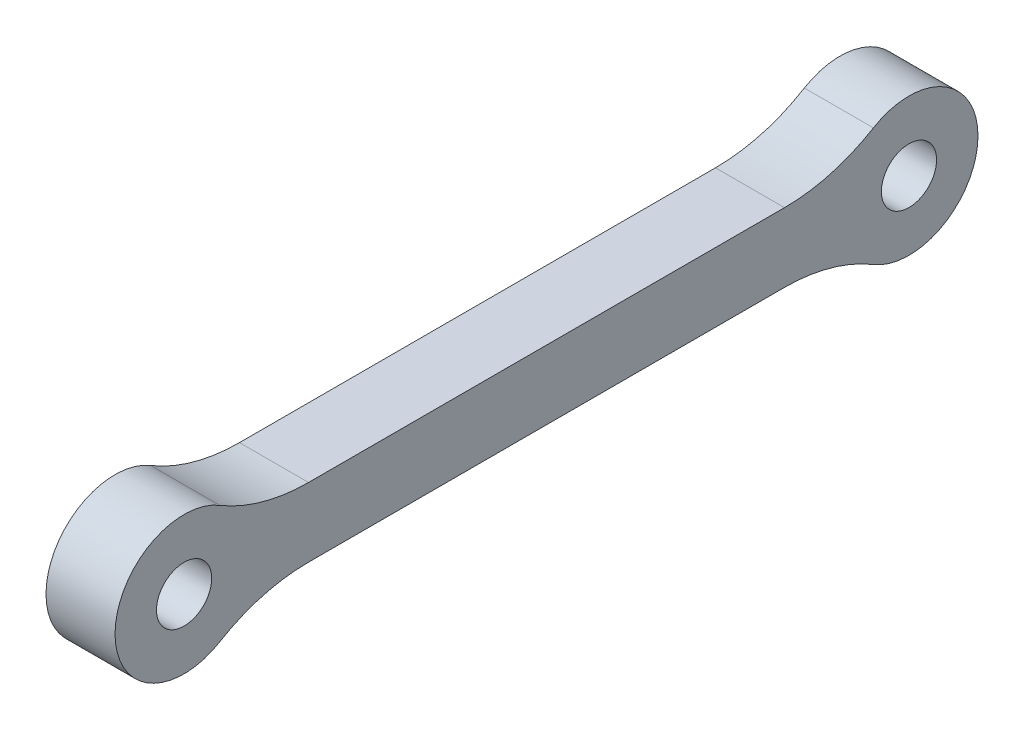
ISO-10303-21;
HEADER;
FILE_DESCRIPTION(('STEP AP214'),'2;1');
FILE_NAME('part.step','',(''),(''),'','','');
FILE_SCHEMA(('AUTOMOTIVE_DESIGN { 1 0 10303 214 1 1 1 1 }'));
ENDSEC;
DATA;
#1=APPLICATION_CONTEXT('core data for automotive mechanical design processes');
#2=APPLICATION_PROTOCOL_DEFINITION('international standard','automotive_design',2000,#1);
#3=PRODUCT_CONTEXT('',#1,'mechanical');
#4=PRODUCT('Part','Part','',(#3));
#5=PRODUCT_RELATED_PRODUCT_CATEGORY('part','',(#4));
#6=PRODUCT_DEFINITION_FORMATION('','',#4);
#7=PRODUCT_DEFINITION_CONTEXT('part definition',#1,'design');
#8=PRODUCT_DEFINITION('design','',#6,#7);
#9=PRODUCT_DEFINITION_SHAPE('','',#8);
#10=(LENGTH_UNIT() NAMED_UNIT(*) SI_UNIT(.MILLI.,.METRE.));
#11=(NAMED_UNIT(*) PLANE_ANGLE_UNIT() SI_UNIT($,.RADIAN.));
#12=(NAMED_UNIT(*) SI_UNIT($,.STERADIAN.) SOLID_ANGLE_UNIT());
#13=UNCERTAINTY_MEASURE_WITH_UNIT(LENGTH_MEASURE(1.E-05),#10,'distance_accuracy_value','');
#14=(GEOMETRIC_REPRESENTATION_CONTEXT(3) GLOBAL_UNCERTAINTY_ASSIGNED_CONTEXT((#13)) GLOBAL_UNIT_ASSIGNED_CONTEXT((#10,
#11,#12)) REPRESENTATION_CONTEXT('',''));
#15=CARTESIAN_POINT('',(0.,0.,0.));
#16=DIRECTION('',(0.,0.,1.));
#17=DIRECTION('',(1.,0.,0.));
#18=AXIS2_PLACEMENT_3D('',#15,#16,#17);
#19=CARTESIAN_POINT('',(4.,0.,0.));
#20=DIRECTION('',(1.,0.,0.));
#21=DIRECTION('',(0.,0.,-1.));
#22=AXIS2_PLACEMENT_3D('',#19,#20,#21);
#23=PLANE('',#22);
#24=CARTESIAN_POINT('',(4.,0.,0.));
#25=DIRECTION('',(1.,0.,0.));
#26=DIRECTION('',(0.,0.,-1.));
#27=AXIS2_PLACEMENT_3D('',#24,#25,#26);
#28=CIRCLE('',#27,1.6);
#29=CARTESIAN_POINT('',(4.,0.,-1.6));
#30=VERTEX_POINT('',#29);
#31=EDGE_CURVE('E129',#30,#30,#28,.T.);
#32=ORIENTED_EDGE('',*,*,#31,.F.);
#33=EDGE_LOOP('',(#32));
#34=FACE_BOUND('',#33,.T.);
#35=CARTESIAN_POINT('',(4.,0.,-42.));
#36=DIRECTION('',(1.,0.,0.));
#37=DIRECTION('',(0.,0.,-1.));
#38=AXIS2_PLACEMENT_3D('',#35,#36,#37);
#39=CIRCLE('',#38,4.);
#40=CARTESIAN_POINT('',(4.,-3.42857142857143,-39.9396849854492));
#41=VERTEX_POINT('',#40);
#42=CARTESIAN_POINT('',(4.,3.42857142857143,-39.9396849854492));
#43=VERTEX_POINT('',#42);
#44=EDGE_CURVE('E138',#41,#43,#39,.T.);
#45=ORIENTED_EDGE('',*,*,#44,.T.);
#46=CARTESIAN_POINT('',(4.,12.,-34.788897449072));
#47=DIRECTION('',(1.,0.,0.));
#48=DIRECTION('',(0.,0.,-1.));
#49=AXIS2_PLACEMENT_3D('',#46,#47,#48);
#50=CIRCLE('',#49,10.);
#51=CARTESIAN_POINT('',(4.,2.,-34.788897449072));
#52=VERTEX_POINT('',#51);
#53=EDGE_CURVE('E11',#43,#52,#50,.F.);
#54=ORIENTED_EDGE('',*,*,#53,.T.);
#55=DIRECTION('',(0.,0.,1.));
#56=VECTOR('',#55,1.);
#57=CARTESIAN_POINT('',(4.,2.,-21.));
#58=LINE('',#57,#56);
#59=CARTESIAN_POINT('',(4.,2.,-7.21110255092798));
#60=VERTEX_POINT('',#59);
#61=EDGE_CURVE('E144',#52,#60,#58,.T.);
#62=ORIENTED_EDGE('',*,*,#61,.T.);
#63=CARTESIAN_POINT('',(4.,12.,-7.21110255092798));
#64=DIRECTION('',(1.,0.,0.));
#65=DIRECTION('',(0.,0.,-1.));
#66=AXIS2_PLACEMENT_3D('',#63,#64,#65);
#67=CIRCLE('',#66,10.);
#68=CARTESIAN_POINT('',(4.,3.42857142857143,-2.06031501455085));
#69=VERTEX_POINT('',#68);
#70=EDGE_CURVE('E110',#60,#69,#67,.F.);
#71=ORIENTED_EDGE('',*,*,#70,.T.);
#72=CARTESIAN_POINT('',(4.,0.,0.));
#73=DIRECTION('',(1.,0.,0.));
#74=DIRECTION('',(0.,0.,-1.));
#75=AXIS2_PLACEMENT_3D('',#72,#73,#74);
#76=CIRCLE('',#75,4.);
#77=CARTESIAN_POINT('',(4.,-3.42857142857143,-2.06031501455085));
#78=VERTEX_POINT('',#77);
#79=EDGE_CURVE('E120',#69,#78,#76,.T.);
#80=ORIENTED_EDGE('',*,*,#79,.T.);
#81=CARTESIAN_POINT('',(4.,-12.,-7.21110255092798));
#82=DIRECTION('',(1.,0.,0.));
#83=DIRECTION('',(0.,0.,-1.));
#84=AXIS2_PLACEMENT_3D('',#81,#82,#83);
#85=CIRCLE('',#84,10.);
#86=CARTESIAN_POINT('',(4.,-2.,-7.21110255092798));
#87=VERTEX_POINT('',#86);
#88=EDGE_CURVE('E159',#78,#87,#85,.F.);
#89=ORIENTED_EDGE('',*,*,#88,.T.);
#90=DIRECTION('',(0.,0.,-1.));
#91=VECTOR('',#90,1.);
#92=CARTESIAN_POINT('',(4.,-2.,-21.));
#93=LINE('',#92,#91);
#94=CARTESIAN_POINT('',(4.,-2.,-34.788897449072));
#95=VERTEX_POINT('',#94);
#96=EDGE_CURVE('E175',#87,#95,#93,.T.);
#97=ORIENTED_EDGE('',*,*,#96,.T.);
#98=CARTESIAN_POINT('',(4.,-12.,-34.788897449072));
#99=DIRECTION('',(1.,0.,0.));
#100=DIRECTION('',(0.,0.,-1.));
#101=AXIS2_PLACEMENT_3D('',#98,#99,#100);
#102=CIRCLE('',#101,10.);
#103=EDGE_CURVE('E56',#95,#41,#102,.F.);
#104=ORIENTED_EDGE('',*,*,#103,.T.);
#105=EDGE_LOOP('',(#45,#54,#62,#71,#80,#89,#97,#104));
#106=FACE_BOUND('',#105,.T.);
#107=CARTESIAN_POINT('',(4.,0.,-42.));
#108=DIRECTION('',(1.,0.,0.));
#109=DIRECTION('',(0.,0.,-1.));
#110=AXIS2_PLACEMENT_3D('',#107,#108,#109);
#111=CIRCLE('',#110,1.6);
#112=CARTESIAN_POINT('',(4.,0.,-43.6));
#113=VERTEX_POINT('',#112);
#114=EDGE_CURVE('E297',#113,#113,#111,.T.);
#115=ORIENTED_EDGE('',*,*,#114,.F.);
#116=EDGE_LOOP('',(#115));
#117=FACE_BOUND('',#116,.T.);
#118=ADVANCED_FACE('F34',(#34,#106,#117),#23,.T.);
#119=CARTESIAN_POINT('',(0.,0.,0.));
#120=DIRECTION('',(1.,0.,0.));
#121=DIRECTION('',(0.,0.,-1.));
#122=AXIS2_PLACEMENT_3D('',#119,#120,#121);
#123=PLANE('',#122);
#124=CARTESIAN_POINT('',(0.,0.,0.));
#125=DIRECTION('',(1.,0.,0.));
#126=DIRECTION('',(0.,0.,-1.));
#127=AXIS2_PLACEMENT_3D('',#124,#125,#126);
#128=CIRCLE('',#127,4.);
#129=CARTESIAN_POINT('',(0.,3.42857142857143,-2.06031501455085));
#130=VERTEX_POINT('',#129);
#131=CARTESIAN_POINT('',(0.,-3.42857142857143,-2.06031501455085));
#132=VERTEX_POINT('',#131);
#133=EDGE_CURVE('E117',#130,#132,#128,.T.);
#134=ORIENTED_EDGE('',*,*,#133,.F.);
#135=CARTESIAN_POINT('',(0.,12.,-7.21110255092798));
#136=DIRECTION('',(1.,0.,0.));
#137=DIRECTION('',(0.,0.,-1.));
#138=AXIS2_PLACEMENT_3D('',#135,#136,#137);
#139=CIRCLE('',#138,10.);
#140=CARTESIAN_POINT('',(0.,2.,-7.21110255092798));
#141=VERTEX_POINT('',#140);
#142=EDGE_CURVE('E100',#130,#141,#139,.T.);
#143=ORIENTED_EDGE('',*,*,#142,.T.);
#144=DIRECTION('',(0.,0.,1.));
#145=VECTOR('',#144,1.);
#146=CARTESIAN_POINT('',(0.,2.,-21.));
#147=LINE('',#146,#145);
#148=CARTESIAN_POINT('',(0.,2.,-34.788897449072));
#149=VERTEX_POINT('',#148);
#150=EDGE_CURVE('E142',#149,#141,#147,.T.);
#151=ORIENTED_EDGE('',*,*,#150,.F.);
#152=CARTESIAN_POINT('',(0.,12.,-34.788897449072));
#153=DIRECTION('',(1.,0.,0.));
#154=DIRECTION('',(0.,0.,-1.));
#155=AXIS2_PLACEMENT_3D('',#152,#153,#154);
#156=CIRCLE('',#155,10.);
#157=CARTESIAN_POINT('',(0.,3.42857142857143,-39.9396849854492));
#158=VERTEX_POINT('',#157);
#159=EDGE_CURVE('E42',#149,#158,#156,.T.);
#160=ORIENTED_EDGE('',*,*,#159,.T.);
#161=CARTESIAN_POINT('',(0.,0.,-42.));
#162=DIRECTION('',(1.,0.,0.));
#163=DIRECTION('',(0.,0.,-1.));
#164=AXIS2_PLACEMENT_3D('',#161,#162,#163);
#165=CIRCLE('',#164,4.);
#166=CARTESIAN_POINT('',(0.,-3.42857142857143,-39.9396849854492));
#167=VERTEX_POINT('',#166);
#168=EDGE_CURVE('E132',#167,#158,#165,.T.);
#169=ORIENTED_EDGE('',*,*,#168,.F.);
#170=CARTESIAN_POINT('',(0.,-12.,-34.788897449072));
#171=DIRECTION('',(1.,0.,0.));
#172=DIRECTION('',(0.,0.,-1.));
#173=AXIS2_PLACEMENT_3D('',#170,#171,#172);
#174=CIRCLE('',#173,10.);
#175=CARTESIAN_POINT('',(0.,-2.,-34.788897449072));
#176=VERTEX_POINT('',#175);
#177=EDGE_CURVE('E161',#167,#176,#174,.T.);
#178=ORIENTED_EDGE('',*,*,#177,.T.);
#179=DIRECTION('',(0.,0.,-1.));
#180=VECTOR('',#179,1.);
#181=CARTESIAN_POINT('',(0.,-2.,-21.));
#182=LINE('',#181,#180);
#183=CARTESIAN_POINT('',(0.,-2.,-7.21110255092798));
#184=VERTEX_POINT('',#183);
#185=EDGE_CURVE('E128',#184,#176,#182,.T.);
#186=ORIENTED_EDGE('',*,*,#185,.F.);
#187=CARTESIAN_POINT('',(0.,-12.,-7.21110255092798));
#188=DIRECTION('',(1.,0.,0.));
#189=DIRECTION('',(0.,0.,-1.));
#190=AXIS2_PLACEMENT_3D('',#187,#188,#189);
#191=CIRCLE('',#190,10.);
#192=EDGE_CURVE('E127',#184,#132,#191,.T.);
#193=ORIENTED_EDGE('',*,*,#192,.T.);
#194=EDGE_LOOP('',(#134,#143,#151,#160,#169,#178,#186,#193));
#195=FACE_BOUND('',#194,.T.);
#196=CARTESIAN_POINT('',(0.,0.,0.));
#197=DIRECTION('',(1.,0.,0.));
#198=DIRECTION('',(0.,0.,-1.));
#199=AXIS2_PLACEMENT_3D('',#196,#197,#198);
#200=CIRCLE('',#199,1.6);
#201=CARTESIAN_POINT('',(0.,0.,-1.6));
#202=VERTEX_POINT('',#201);
#203=EDGE_CURVE('E135',#202,#202,#200,.T.);
#204=ORIENTED_EDGE('',*,*,#203,.T.);
#205=EDGE_LOOP('',(#204));
#206=FACE_BOUND('',#205,.T.);
#207=CARTESIAN_POINT('',(0.,0.,-42.));
#208=DIRECTION('',(1.,0.,0.));
#209=DIRECTION('',(0.,0.,-1.));
#210=AXIS2_PLACEMENT_3D('',#207,#208,#209);
#211=CIRCLE('',#210,1.6);
#212=CARTESIAN_POINT('',(0.,0.,-43.6));
#213=VERTEX_POINT('',#212);
#214=EDGE_CURVE('E300',#213,#213,#211,.T.);
#215=ORIENTED_EDGE('',*,*,#214,.T.);
#216=EDGE_LOOP('',(#215));
#217=FACE_BOUND('',#216,.T.);
#218=ADVANCED_FACE('F124',(#195,#206,#217),#123,.F.);
#219=CARTESIAN_POINT('',(4.,0.,0.));
#220=DIRECTION('',(-1.,0.,0.));
#221=DIRECTION('',(0.,0.,1.));
#222=AXIS2_PLACEMENT_3D('',#219,#220,#221);
#223=CYLINDRICAL_SURFACE('',#222,4.);
#224=ORIENTED_EDGE('',*,*,#79,.F.);
#225=DIRECTION('',(-1.,0.,0.));
#226=VECTOR('',#225,1.);
#227=CARTESIAN_POINT('',(4.,3.42857142857143,-2.06031501455085));
#228=LINE('',#227,#226);
#229=EDGE_CURVE('E104',#69,#130,#228,.T.);
#230=ORIENTED_EDGE('',*,*,#229,.T.);
#231=ORIENTED_EDGE('',*,*,#133,.T.);
#232=DIRECTION('',(-1.,0.,0.));
#233=VECTOR('',#232,1.);
#234=CARTESIAN_POINT('',(4.,-3.42857142857143,-2.06031501455085));
#235=LINE('',#234,#233);
#236=EDGE_CURVE('E122',#132,#78,#235,.F.);
#237=ORIENTED_EDGE('',*,*,#236,.T.);
#238=EDGE_LOOP('',(#224,#230,#231,#237));
#239=FACE_BOUND('',#238,.T.);
#240=ADVANCED_FACE('F116',(#239),#223,.T.);
#241=CARTESIAN_POINT('',(4.,-2.,-21.));
#242=DIRECTION('',(0.,1.,0.));
#243=DIRECTION('',(0.,0.,1.));
#244=AXIS2_PLACEMENT_3D('',#241,#242,#243);
#245=PLANE('',#244);
#246=ORIENTED_EDGE('',*,*,#96,.F.);
#247=DIRECTION('',(1.,0.,0.));
#248=VECTOR('',#247,1.);
#249=CARTESIAN_POINT('',(0.,-2.,-7.21110255092798));
#250=LINE('',#249,#248);
#251=EDGE_CURVE('E151',#87,#184,#250,.F.);
#252=ORIENTED_EDGE('',*,*,#251,.T.);
#253=ORIENTED_EDGE('',*,*,#185,.T.);
#254=DIRECTION('',(1.,0.,0.));
#255=VECTOR('',#254,1.);
#256=CARTESIAN_POINT('',(4.,-2.,-34.788897449072));
#257=LINE('',#256,#255);
#258=EDGE_CURVE('E149',#176,#95,#257,.T.);
#259=ORIENTED_EDGE('',*,*,#258,.T.);
#260=EDGE_LOOP('',(#246,#252,#253,#259));
#261=FACE_BOUND('',#260,.T.);
#262=ADVANCED_FACE('F185',(#261),#245,.F.);
#263=CARTESIAN_POINT('',(4.,0.,-42.));
#264=DIRECTION('',(-1.,0.,0.));
#265=DIRECTION('',(0.,0.,1.));
#266=AXIS2_PLACEMENT_3D('',#263,#264,#265);
#267=CYLINDRICAL_SURFACE('',#266,4.);
#268=ORIENTED_EDGE('',*,*,#44,.F.);
#269=DIRECTION('',(-1.,0.,0.));
#270=VECTOR('',#269,1.);
#271=CARTESIAN_POINT('',(4.,-3.42857142857143,-39.9396849854492));
#272=LINE('',#271,#270);
#273=EDGE_CURVE('E111',#41,#167,#272,.T.);
#274=ORIENTED_EDGE('',*,*,#273,.T.);
#275=ORIENTED_EDGE('',*,*,#168,.T.);
#276=DIRECTION('',(-1.,0.,0.));
#277=VECTOR('',#276,1.);
#278=CARTESIAN_POINT('',(4.,3.42857142857143,-39.9396849854492));
#279=LINE('',#278,#277);
#280=EDGE_CURVE('E49',#158,#43,#279,.F.);
#281=ORIENTED_EDGE('',*,*,#280,.T.);
#282=EDGE_LOOP('',(#268,#274,#275,#281));
#283=FACE_BOUND('',#282,.T.);
#284=ADVANCED_FACE('F166',(#283),#267,.T.);
#285=CARTESIAN_POINT('',(4.,2.,-21.));
#286=DIRECTION('',(0.,-1.,0.));
#287=DIRECTION('',(0.,0.,-1.));
#288=AXIS2_PLACEMENT_3D('',#285,#286,#287);
#289=PLANE('',#288);
#290=ORIENTED_EDGE('',*,*,#150,.T.);
#291=DIRECTION('',(1.,0.,0.));
#292=VECTOR('',#291,1.);
#293=CARTESIAN_POINT('',(4.,2.,-7.21110255092798));
#294=LINE('',#293,#292);
#295=EDGE_CURVE('E105',#141,#60,#294,.T.);
#296=ORIENTED_EDGE('',*,*,#295,.T.);
#297=ORIENTED_EDGE('',*,*,#61,.F.);
#298=DIRECTION('',(1.,0.,0.));
#299=VECTOR('',#298,1.);
#300=CARTESIAN_POINT('',(0.,2.,-34.788897449072));
#301=LINE('',#300,#299);
#302=EDGE_CURVE('E121',#52,#149,#301,.F.);
#303=ORIENTED_EDGE('',*,*,#302,.T.);
#304=EDGE_LOOP('',(#290,#296,#297,#303));
#305=FACE_BOUND('',#304,.T.);
#306=ADVANCED_FACE('F173',(#305),#289,.F.);
#307=CARTESIAN_POINT('',(4.,0.,0.));
#308=DIRECTION('',(-1.,0.,0.));
#309=DIRECTION('',(0.,0.,1.));
#310=AXIS2_PLACEMENT_3D('',#307,#308,#309);
#311=CYLINDRICAL_SURFACE('',#310,1.6);
#312=ORIENTED_EDGE('',*,*,#31,.T.);
#313=EDGE_LOOP('',(#312));
#314=FACE_BOUND('',#313,.T.);
#315=ORIENTED_EDGE('',*,*,#203,.F.);
#316=EDGE_LOOP('',(#315));
#317=FACE_BOUND('',#316,.T.);
#318=ADVANCED_FACE('F205',(#314,#317),#311,.F.);
#319=CARTESIAN_POINT('',(4.,0.,-42.));
#320=DIRECTION('',(-1.,0.,0.));
#321=DIRECTION('',(0.,0.,1.));
#322=AXIS2_PLACEMENT_3D('',#319,#320,#321);
#323=CYLINDRICAL_SURFACE('',#322,1.6);
#324=ORIENTED_EDGE('',*,*,#114,.T.);
#325=EDGE_LOOP('',(#324));
#326=FACE_BOUND('',#325,.T.);
#327=ORIENTED_EDGE('',*,*,#214,.F.);
#328=EDGE_LOOP('',(#327));
#329=FACE_BOUND('',#328,.T.);
#330=ADVANCED_FACE('F194',(#326,#329),#323,.F.);
#331=CARTESIAN_POINT('',(4.,12.,-7.21110255092798));
#332=DIRECTION('',(-1.,0.,0.));
#333=DIRECTION('',(0.,0.,1.));
#334=AXIS2_PLACEMENT_3D('',#331,#332,#333);
#335=CYLINDRICAL_SURFACE('',#334,10.);
#336=ORIENTED_EDGE('',*,*,#70,.F.);
#337=ORIENTED_EDGE('',*,*,#295,.F.);
#338=ORIENTED_EDGE('',*,*,#142,.F.);
#339=ORIENTED_EDGE('',*,*,#229,.F.);
#340=EDGE_LOOP('',(#336,#337,#338,#339));
#341=FACE_BOUND('',#340,.T.);
#342=ADVANCED_FACE('F103',(#341),#335,.F.);
#343=CARTESIAN_POINT('',(4.,-12.,-7.21110255092798));
#344=DIRECTION('',(-1.,0.,0.));
#345=DIRECTION('',(0.,0.,1.));
#346=AXIS2_PLACEMENT_3D('',#343,#344,#345);
#347=CYLINDRICAL_SURFACE('',#346,10.);
#348=ORIENTED_EDGE('',*,*,#88,.F.);
#349=ORIENTED_EDGE('',*,*,#236,.F.);
#350=ORIENTED_EDGE('',*,*,#192,.F.);
#351=ORIENTED_EDGE('',*,*,#251,.F.);
#352=EDGE_LOOP('',(#348,#349,#350,#351));
#353=FACE_BOUND('',#352,.T.);
#354=ADVANCED_FACE('F187',(#353),#347,.F.);
#355=CARTESIAN_POINT('',(4.,-12.,-34.788897449072));
#356=DIRECTION('',(-1.,0.,0.));
#357=DIRECTION('',(0.,0.,1.));
#358=AXIS2_PLACEMENT_3D('',#355,#356,#357);
#359=CYLINDRICAL_SURFACE('',#358,10.);
#360=ORIENTED_EDGE('',*,*,#103,.F.);
#361=ORIENTED_EDGE('',*,*,#258,.F.);
#362=ORIENTED_EDGE('',*,*,#177,.F.);
#363=ORIENTED_EDGE('',*,*,#273,.F.);
#364=EDGE_LOOP('',(#360,#361,#362,#363));
#365=FACE_BOUND('',#364,.T.);
#366=ADVANCED_FACE('F184',(#365),#359,.F.);
#367=CARTESIAN_POINT('',(4.,12.,-34.788897449072));
#368=DIRECTION('',(-1.,0.,0.));
#369=DIRECTION('',(0.,0.,1.));
#370=AXIS2_PLACEMENT_3D('',#367,#368,#369);
#371=CYLINDRICAL_SURFACE('',#370,10.);
#372=ORIENTED_EDGE('',*,*,#53,.F.);
#373=ORIENTED_EDGE('',*,*,#280,.F.);
#374=ORIENTED_EDGE('',*,*,#159,.F.);
#375=ORIENTED_EDGE('',*,*,#302,.F.);
#376=EDGE_LOOP('',(#372,#373,#374,#375));
#377=FACE_BOUND('',#376,.T.);
#378=ADVANCED_FACE('F36',(#377),#371,.F.);
#379=CLOSED_SHELL('',(#118,#218,#240,#262,#284,#306,#318,#330,#342,#354,#366,#378));
#380=MANIFOLD_SOLID_BREP('B2',#379);
#381=ADVANCED_BREP_SHAPE_REPRESENTATION('',(#18,#380),#14);
#382=SHAPE_DEFINITION_REPRESENTATION(#9,#381);
ENDSEC;
END-ISO-10303-21;
